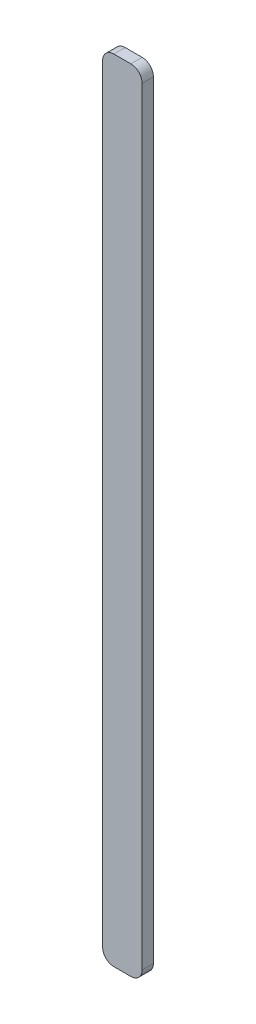
ISO-10303-21;
HEADER;
FILE_DESCRIPTION(('STEP AP214'),'2;1');
FILE_NAME('part.step','',(''),(''),'','','');
FILE_SCHEMA(('AUTOMOTIVE_DESIGN { 1 0 10303 214 1 1 1 1 }'));
ENDSEC;
DATA;
#1=APPLICATION_CONTEXT('core data for automotive mechanical design processes');
#2=APPLICATION_PROTOCOL_DEFINITION('international standard','automotive_design',2000,#1);
#3=PRODUCT_CONTEXT('',#1,'mechanical');
#4=PRODUCT('Part','Part','',(#3));
#5=PRODUCT_RELATED_PRODUCT_CATEGORY('part','',(#4));
#6=PRODUCT_DEFINITION_FORMATION('','',#4);
#7=PRODUCT_DEFINITION_CONTEXT('part definition',#1,'design');
#8=PRODUCT_DEFINITION('design','',#6,#7);
#9=PRODUCT_DEFINITION_SHAPE('','',#8);
#10=(LENGTH_UNIT() NAMED_UNIT(*) SI_UNIT(.MILLI.,.METRE.));
#11=(NAMED_UNIT(*) PLANE_ANGLE_UNIT() SI_UNIT($,.RADIAN.));
#12=(NAMED_UNIT(*) SI_UNIT($,.STERADIAN.) SOLID_ANGLE_UNIT());
#13=UNCERTAINTY_MEASURE_WITH_UNIT(LENGTH_MEASURE(1.E-05),#10,'distance_accuracy_value','');
#14=(GEOMETRIC_REPRESENTATION_CONTEXT(3) GLOBAL_UNCERTAINTY_ASSIGNED_CONTEXT((#13)) GLOBAL_UNIT_ASSIGNED_CONTEXT((#10,
#11,#12)) REPRESENTATION_CONTEXT('',''));
#15=CARTESIAN_POINT('',(0.,0.,0.));
#16=DIRECTION('',(0.,0.,1.));
#17=DIRECTION('',(1.,0.,0.));
#18=AXIS2_PLACEMENT_3D('',#15,#16,#17);
#19=CARTESIAN_POINT('',(-1.49999999999999,163.,-12.));
#20=DIRECTION('',(0.,0.,1.));
#21=DIRECTION('',(1.,0.,0.));
#22=AXIS2_PLACEMENT_3D('',#19,#20,#21);
#23=CYLINDRICAL_SURFACE('',#22,2.);
#24=CARTESIAN_POINT('',(-1.49999999999999,163.,-10.));
#25=DIRECTION('',(0.,0.,1.));
#26=DIRECTION('',(1.,0.,0.));
#27=AXIS2_PLACEMENT_3D('',#24,#25,#26);
#28=CIRCLE('',#27,2.);
#29=CARTESIAN_POINT('',(-1.49999999999999,165.,-10.));
#30=VERTEX_POINT('',#29);
#31=CARTESIAN_POINT('',(-3.49999999999999,162.999999999998,-10.));
#32=VERTEX_POINT('',#31);
#33=EDGE_CURVE('E139',#30,#32,#28,.T.);
#34=ORIENTED_EDGE('',*,*,#33,.F.);
#35=DIRECTION('',(0.,0.,1.));
#36=VECTOR('',#35,1.);
#37=CARTESIAN_POINT('',(-1.49999999999999,165.,-12.));
#38=LINE('',#37,#36);
#39=CARTESIAN_POINT('',(-1.49999999999999,165.,-12.));
#40=VERTEX_POINT('',#39);
#41=EDGE_CURVE('E11',#40,#30,#38,.T.);
#42=ORIENTED_EDGE('',*,*,#41,.F.);
#43=CARTESIAN_POINT('',(-1.49999999999999,163.,-12.));
#44=DIRECTION('',(0.,0.,1.));
#45=DIRECTION('',(1.,0.,0.));
#46=AXIS2_PLACEMENT_3D('',#43,#44,#45);
#47=CIRCLE('',#46,2.);
#48=CARTESIAN_POINT('',(-3.49999999999999,162.999999999998,-12.));
#49=VERTEX_POINT('',#48);
#50=EDGE_CURVE('E159',#40,#49,#47,.T.);
#51=ORIENTED_EDGE('',*,*,#50,.T.);
#52=DIRECTION('',(0.,0.,1.));
#53=VECTOR('',#52,1.);
#54=CARTESIAN_POINT('',(-3.49999999999999,162.999999999998,-12.));
#55=LINE('',#54,#53);
#56=EDGE_CURVE('E45',#49,#32,#55,.T.);
#57=ORIENTED_EDGE('',*,*,#56,.T.);
#58=EDGE_LOOP('',(#34,#42,#51,#57));
#59=FACE_BOUND('',#58,.T.);
#60=ADVANCED_FACE('F42',(#59),#23,.T.);
#61=CARTESIAN_POINT('',(-1.49999999999999,165.,-12.));
#62=DIRECTION('',(0.,1.,0.));
#63=DIRECTION('',(0.,0.,1.));
#64=AXIS2_PLACEMENT_3D('',#61,#62,#63);
#65=PLANE('',#64);
#66=DIRECTION('',(-1.,0.,0.));
#67=VECTOR('',#66,1.);
#68=CARTESIAN_POINT('',(-1.49999999999999,165.,-10.));
#69=LINE('',#68,#67);
#70=CARTESIAN_POINT('',(1.49999999999998,165.,-10.));
#71=VERTEX_POINT('',#70);
#72=EDGE_CURVE('E157',#71,#30,#69,.T.);
#73=ORIENTED_EDGE('',*,*,#72,.F.);
#74=DIRECTION('',(0.,0.,1.));
#75=VECTOR('',#74,1.);
#76=CARTESIAN_POINT('',(1.49999999999998,165.,-12.));
#77=LINE('',#76,#75);
#78=CARTESIAN_POINT('',(1.49999999999998,165.,-12.));
#79=VERTEX_POINT('',#78);
#80=EDGE_CURVE('E51',#79,#71,#77,.T.);
#81=ORIENTED_EDGE('',*,*,#80,.F.);
#82=DIRECTION('',(-1.,0.,0.));
#83=VECTOR('',#82,1.);
#84=CARTESIAN_POINT('',(-1.49999999999999,165.,-12.));
#85=LINE('',#84,#83);
#86=EDGE_CURVE('E129',#79,#40,#85,.T.);
#87=ORIENTED_EDGE('',*,*,#86,.T.);
#88=ORIENTED_EDGE('',*,*,#41,.T.);
#89=EDGE_LOOP('',(#73,#81,#87,#88));
#90=FACE_BOUND('',#89,.T.);
#91=ADVANCED_FACE('F171',(#90),#65,.T.);
#92=CARTESIAN_POINT('',(1.49999999999998,163.,-12.));
#93=DIRECTION('',(0.,0.,1.));
#94=DIRECTION('',(1.,0.,0.));
#95=AXIS2_PLACEMENT_3D('',#92,#93,#94);
#96=CYLINDRICAL_SURFACE('',#95,2.);
#97=CARTESIAN_POINT('',(1.49999999999998,163.,-10.));
#98=DIRECTION('',(0.,0.,1.));
#99=DIRECTION('',(1.,0.,0.));
#100=AXIS2_PLACEMENT_3D('',#97,#98,#99);
#101=CIRCLE('',#100,2.);
#102=CARTESIAN_POINT('',(3.49999999999998,163.,-10.));
#103=VERTEX_POINT('',#102);
#104=EDGE_CURVE('E116',#103,#71,#101,.T.);
#105=ORIENTED_EDGE('',*,*,#104,.F.);
#106=DIRECTION('',(0.,0.,1.));
#107=VECTOR('',#106,1.);
#108=CARTESIAN_POINT('',(3.49999999999998,163.,-12.));
#109=LINE('',#108,#107);
#110=CARTESIAN_POINT('',(3.49999999999998,163.,-12.));
#111=VERTEX_POINT('',#110);
#112=EDGE_CURVE('E111',#111,#103,#109,.T.);
#113=ORIENTED_EDGE('',*,*,#112,.F.);
#114=CARTESIAN_POINT('',(1.49999999999998,163.,-12.));
#115=DIRECTION('',(0.,0.,1.));
#116=DIRECTION('',(1.,0.,0.));
#117=AXIS2_PLACEMENT_3D('',#114,#115,#116);
#118=CIRCLE('',#117,2.);
#119=EDGE_CURVE('E114',#111,#79,#118,.T.);
#120=ORIENTED_EDGE('',*,*,#119,.T.);
#121=ORIENTED_EDGE('',*,*,#80,.T.);
#122=EDGE_LOOP('',(#105,#113,#120,#121));
#123=FACE_BOUND('',#122,.T.);
#124=ADVANCED_FACE('F113',(#123),#96,.T.);
#125=CARTESIAN_POINT('',(3.49999999999998,163.,-12.));
#126=DIRECTION('',(1.,0.,0.));
#127=DIRECTION('',(0.,0.,-1.));
#128=AXIS2_PLACEMENT_3D('',#125,#126,#127);
#129=PLANE('',#128);
#130=DIRECTION('',(0.,1.,0.));
#131=VECTOR('',#130,1.);
#132=CARTESIAN_POINT('',(3.49999999999998,163.,-10.));
#133=LINE('',#132,#131);
#134=CARTESIAN_POINT('',(3.49999999999998,27.,-10.));
#135=VERTEX_POINT('',#134);
#136=EDGE_CURVE('E154',#135,#103,#133,.T.);
#137=ORIENTED_EDGE('',*,*,#136,.F.);
#138=DIRECTION('',(0.,0.,1.));
#139=VECTOR('',#138,1.);
#140=CARTESIAN_POINT('',(3.49999999999998,27.,-12.));
#141=LINE('',#140,#139);
#142=CARTESIAN_POINT('',(3.49999999999998,27.,-12.));
#143=VERTEX_POINT('',#142);
#144=EDGE_CURVE('E121',#143,#135,#141,.T.);
#145=ORIENTED_EDGE('',*,*,#144,.F.);
#146=DIRECTION('',(0.,1.,0.));
#147=VECTOR('',#146,1.);
#148=CARTESIAN_POINT('',(3.49999999999998,163.,-12.));
#149=LINE('',#148,#147);
#150=EDGE_CURVE('E127',#143,#111,#149,.T.);
#151=ORIENTED_EDGE('',*,*,#150,.T.);
#152=ORIENTED_EDGE('',*,*,#112,.T.);
#153=EDGE_LOOP('',(#137,#145,#151,#152));
#154=FACE_BOUND('',#153,.T.);
#155=ADVANCED_FACE('F131',(#154),#129,.T.);
#156=CARTESIAN_POINT('',(1.49999999999998,27.,-12.));
#157=DIRECTION('',(0.,0.,1.));
#158=DIRECTION('',(1.,0.,0.));
#159=AXIS2_PLACEMENT_3D('',#156,#157,#158);
#160=CYLINDRICAL_SURFACE('',#159,2.);
#161=CARTESIAN_POINT('',(1.49999999999998,27.,-10.));
#162=DIRECTION('',(0.,0.,1.));
#163=DIRECTION('',(1.,0.,0.));
#164=AXIS2_PLACEMENT_3D('',#161,#162,#163);
#165=CIRCLE('',#164,2.);
#166=CARTESIAN_POINT('',(1.49999999999998,25.,-10.));
#167=VERTEX_POINT('',#166);
#168=EDGE_CURVE('E151',#167,#135,#165,.T.);
#169=ORIENTED_EDGE('',*,*,#168,.F.);
#170=DIRECTION('',(0.,0.,1.));
#171=VECTOR('',#170,1.);
#172=CARTESIAN_POINT('',(1.49999999999998,25.,-12.));
#173=LINE('',#172,#171);
#174=CARTESIAN_POINT('',(1.49999999999998,25.,-12.));
#175=VERTEX_POINT('',#174);
#176=EDGE_CURVE('E163',#175,#167,#173,.T.);
#177=ORIENTED_EDGE('',*,*,#176,.F.);
#178=CARTESIAN_POINT('',(1.49999999999998,27.,-12.));
#179=DIRECTION('',(0.,0.,1.));
#180=DIRECTION('',(1.,0.,0.));
#181=AXIS2_PLACEMENT_3D('',#178,#179,#180);
#182=CIRCLE('',#181,2.);
#183=EDGE_CURVE('E132',#175,#143,#182,.T.);
#184=ORIENTED_EDGE('',*,*,#183,.T.);
#185=ORIENTED_EDGE('',*,*,#144,.T.);
#186=EDGE_LOOP('',(#169,#177,#184,#185));
#187=FACE_BOUND('',#186,.T.);
#188=ADVANCED_FACE('F184',(#187),#160,.T.);
#189=CARTESIAN_POINT('',(1.49999999999998,25.,-12.));
#190=DIRECTION('',(0.,-1.,0.));
#191=DIRECTION('',(0.,0.,-1.));
#192=AXIS2_PLACEMENT_3D('',#189,#190,#191);
#193=PLANE('',#192);
#194=DIRECTION('',(1.,0.,0.));
#195=VECTOR('',#194,1.);
#196=CARTESIAN_POINT('',(1.49999999999998,25.,-10.));
#197=LINE('',#196,#195);
#198=CARTESIAN_POINT('',(-1.50000000000002,25.,-10.));
#199=VERTEX_POINT('',#198);
#200=EDGE_CURVE('E148',#199,#167,#197,.T.);
#201=ORIENTED_EDGE('',*,*,#200,.F.);
#202=DIRECTION('',(0.,0.,1.));
#203=VECTOR('',#202,1.);
#204=CARTESIAN_POINT('',(-1.50000000000002,25.,-12.));
#205=LINE('',#204,#203);
#206=CARTESIAN_POINT('',(-1.50000000000002,25.,-12.));
#207=VERTEX_POINT('',#206);
#208=EDGE_CURVE('E165',#207,#199,#205,.T.);
#209=ORIENTED_EDGE('',*,*,#208,.F.);
#210=DIRECTION('',(1.,0.,0.));
#211=VECTOR('',#210,1.);
#212=CARTESIAN_POINT('',(1.49999999999998,25.,-12.));
#213=LINE('',#212,#211);
#214=EDGE_CURVE('E134',#207,#175,#213,.T.);
#215=ORIENTED_EDGE('',*,*,#214,.T.);
#216=ORIENTED_EDGE('',*,*,#176,.T.);
#217=EDGE_LOOP('',(#201,#209,#215,#216));
#218=FACE_BOUND('',#217,.T.);
#219=ADVANCED_FACE('F187',(#218),#193,.T.);
#220=CARTESIAN_POINT('',(-1.50000000000002,27.,-12.));
#221=DIRECTION('',(0.,0.,1.));
#222=DIRECTION('',(1.,0.,0.));
#223=AXIS2_PLACEMENT_3D('',#220,#221,#222);
#224=CYLINDRICAL_SURFACE('',#223,2.);
#225=CARTESIAN_POINT('',(-1.50000000000002,27.,-10.));
#226=DIRECTION('',(0.,0.,1.));
#227=DIRECTION('',(1.,0.,0.));
#228=AXIS2_PLACEMENT_3D('',#225,#226,#227);
#229=CIRCLE('',#228,2.);
#230=CARTESIAN_POINT('',(-3.50000000000002,26.9999999999983,-10.));
#231=VERTEX_POINT('',#230);
#232=EDGE_CURVE('E145',#231,#199,#229,.T.);
#233=ORIENTED_EDGE('',*,*,#232,.F.);
#234=DIRECTION('',(0.,0.,1.));
#235=VECTOR('',#234,1.);
#236=CARTESIAN_POINT('',(-3.50000000000002,26.9999999999983,-12.));
#237=LINE('',#236,#235);
#238=CARTESIAN_POINT('',(-3.50000000000002,26.9999999999983,-12.));
#239=VERTEX_POINT('',#238);
#240=EDGE_CURVE('E166',#239,#231,#237,.T.);
#241=ORIENTED_EDGE('',*,*,#240,.F.);
#242=CARTESIAN_POINT('',(-1.50000000000002,27.,-12.));
#243=DIRECTION('',(0.,0.,1.));
#244=DIRECTION('',(1.,0.,0.));
#245=AXIS2_PLACEMENT_3D('',#242,#243,#244);
#246=CIRCLE('',#245,2.);
#247=EDGE_CURVE('E262',#239,#207,#246,.T.);
#248=ORIENTED_EDGE('',*,*,#247,.T.);
#249=ORIENTED_EDGE('',*,*,#208,.T.);
#250=EDGE_LOOP('',(#233,#241,#248,#249));
#251=FACE_BOUND('',#250,.T.);
#252=ADVANCED_FACE('F191',(#251),#224,.T.);
#253=CARTESIAN_POINT('',(-3.50000000000002,26.9999999999983,-12.));
#254=DIRECTION('',(-1.,0.,0.));
#255=DIRECTION('',(0.,-1.,0.));
#256=AXIS2_PLACEMENT_3D('',#253,#254,#255);
#257=PLANE('',#256);
#258=DIRECTION('',(0.,-1.,0.));
#259=VECTOR('',#258,1.);
#260=CARTESIAN_POINT('',(-3.50000000000002,26.9999999999983,-10.));
#261=LINE('',#260,#259);
#262=EDGE_CURVE('E142',#32,#231,#261,.T.);
#263=ORIENTED_EDGE('',*,*,#262,.F.);
#264=ORIENTED_EDGE('',*,*,#56,.F.);
#265=DIRECTION('',(0.,-1.,0.));
#266=VECTOR('',#265,1.);
#267=CARTESIAN_POINT('',(-3.50000000000002,26.9999999999983,-12.));
#268=LINE('',#267,#266);
#269=EDGE_CURVE('E263',#49,#239,#268,.T.);
#270=ORIENTED_EDGE('',*,*,#269,.T.);
#271=ORIENTED_EDGE('',*,*,#240,.T.);
#272=EDGE_LOOP('',(#263,#264,#270,#271));
#273=FACE_BOUND('',#272,.T.);
#274=ADVANCED_FACE('F168',(#273),#257,.T.);
#275=CARTESIAN_POINT('',(-1.49999999999999,163.,-12.));
#276=DIRECTION('',(0.,0.,1.));
#277=DIRECTION('',(1.,0.,0.));
#278=AXIS2_PLACEMENT_3D('',#275,#276,#277);
#279=PLANE('',#278);
#280=ORIENTED_EDGE('',*,*,#50,.F.);
#281=ORIENTED_EDGE('',*,*,#86,.F.);
#282=ORIENTED_EDGE('',*,*,#119,.F.);
#283=ORIENTED_EDGE('',*,*,#150,.F.);
#284=ORIENTED_EDGE('',*,*,#183,.F.);
#285=ORIENTED_EDGE('',*,*,#214,.F.);
#286=ORIENTED_EDGE('',*,*,#247,.F.);
#287=ORIENTED_EDGE('',*,*,#269,.F.);
#288=EDGE_LOOP('',(#280,#281,#282,#283,#284,#285,#286,#287));
#289=FACE_BOUND('',#288,.T.);
#290=ADVANCED_FACE('F125',(#289),#279,.F.);
#291=CARTESIAN_POINT('',(-1.49999999999999,163.,-10.));
#292=DIRECTION('',(0.,0.,1.));
#293=DIRECTION('',(1.,0.,0.));
#294=AXIS2_PLACEMENT_3D('',#291,#292,#293);
#295=PLANE('',#294);
#296=ORIENTED_EDGE('',*,*,#33,.T.);
#297=ORIENTED_EDGE('',*,*,#262,.T.);
#298=ORIENTED_EDGE('',*,*,#232,.T.);
#299=ORIENTED_EDGE('',*,*,#200,.T.);
#300=ORIENTED_EDGE('',*,*,#168,.T.);
#301=ORIENTED_EDGE('',*,*,#136,.T.);
#302=ORIENTED_EDGE('',*,*,#104,.T.);
#303=ORIENTED_EDGE('',*,*,#72,.T.);
#304=EDGE_LOOP('',(#296,#297,#298,#299,#300,#301,#302,#303));
#305=FACE_BOUND('',#304,.T.);
#306=ADVANCED_FACE('F170',(#305),#295,.T.);
#307=CLOSED_SHELL('',(#60,#91,#124,#155,#188,#219,#252,#274,#290,#306));
#308=MANIFOLD_SOLID_BREP('B2',#307);
#309=ADVANCED_BREP_SHAPE_REPRESENTATION('',(#18,#308),#14);
#310=SHAPE_DEFINITION_REPRESENTATION(#9,#309);
ENDSEC;
END-ISO-10303-21;
